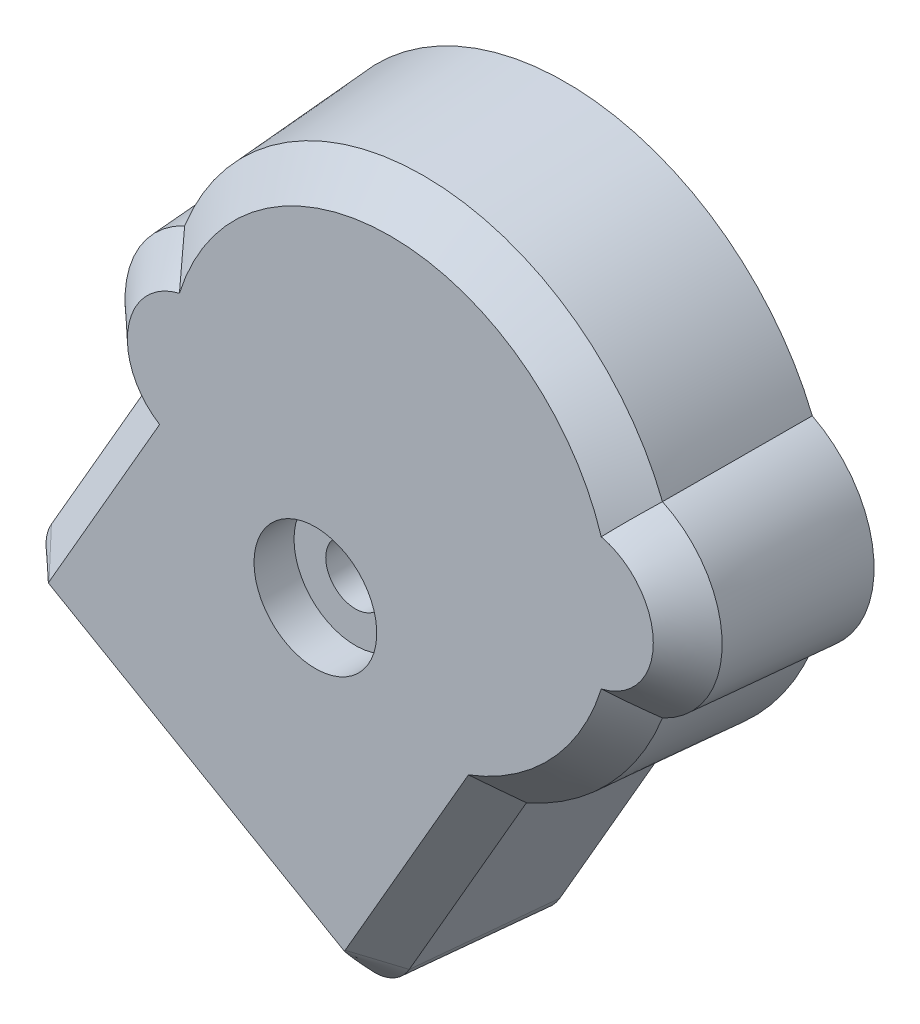
ISO-10303-21;
HEADER;
FILE_DESCRIPTION(('STEP AP214'),'2;1');
FILE_NAME('part.step','',(''),(''),'','','');
FILE_SCHEMA(('AUTOMOTIVE_DESIGN { 1 0 10303 214 1 1 1 1 }'));
ENDSEC;
DATA;
#1=APPLICATION_CONTEXT('core data for automotive mechanical design processes');
#2=APPLICATION_PROTOCOL_DEFINITION('international standard','automotive_design',2000,#1);
#3=PRODUCT_CONTEXT('',#1,'mechanical');
#4=PRODUCT('Part','Part','',(#3));
#5=PRODUCT_RELATED_PRODUCT_CATEGORY('part','',(#4));
#6=PRODUCT_DEFINITION_FORMATION('','',#4);
#7=PRODUCT_DEFINITION_CONTEXT('part definition',#1,'design');
#8=PRODUCT_DEFINITION('design','',#6,#7);
#9=PRODUCT_DEFINITION_SHAPE('','',#8);
#10=(LENGTH_UNIT() NAMED_UNIT(*) SI_UNIT(.MILLI.,.METRE.));
#11=(NAMED_UNIT(*) PLANE_ANGLE_UNIT() SI_UNIT($,.RADIAN.));
#12=(NAMED_UNIT(*) SI_UNIT($,.STERADIAN.) SOLID_ANGLE_UNIT());
#13=UNCERTAINTY_MEASURE_WITH_UNIT(LENGTH_MEASURE(1.E-05),#10,'distance_accuracy_value','');
#14=(GEOMETRIC_REPRESENTATION_CONTEXT(3) GLOBAL_UNCERTAINTY_ASSIGNED_CONTEXT((#13)) GLOBAL_UNIT_ASSIGNED_CONTEXT((#10,
#11,#12)) REPRESENTATION_CONTEXT('',''));
#15=CARTESIAN_POINT('',(0.,0.,0.));
#16=DIRECTION('',(0.,0.,1.));
#17=DIRECTION('',(1.,0.,0.));
#18=AXIS2_PLACEMENT_3D('',#15,#16,#17);
#19=CARTESIAN_POINT('',(0.,0.,13.0302));
#20=DIRECTION('',(0.,0.,1.));
#21=DIRECTION('',(-0.5,-0.866025403784438,0.));
#22=AXIS2_PLACEMENT_3D('',#19,#20,#21);
#23=PLANE('',#22);
#24=CARTESIAN_POINT('',(-2.8575,-4.94933518262807,13.0302));
#25=DIRECTION('',(0.,0.,-1.));
#26=DIRECTION('',(-1.,0.,0.));
#27=AXIS2_PLACEMENT_3D('',#24,#25,#26);
#28=CIRCLE('',#27,2.339213);
#29=CARTESIAN_POINT('',(-5.196713,-4.94933518262807,13.0302));
#30=VERTEX_POINT('',#29);
#31=EDGE_CURVE('E270',#30,#30,#28,.T.);
#32=ORIENTED_EDGE('',*,*,#31,.T.);
#33=EDGE_LOOP('',(#32));
#34=FACE_BOUND('',#33,.T.);
#35=CARTESIAN_POINT('',(0.,0.,13.0302));
#36=DIRECTION('',(0.,0.,1.));
#37=DIRECTION('',(1.,0.,0.));
#38=AXIS2_PLACEMENT_3D('',#35,#36,#37);
#39=CIRCLE('',#38,8.42287491085496);
#40=CARTESIAN_POINT('',(2.97714977771852,-7.87917514495906,13.0302));
#41=VERTEX_POINT('',#40);
#42=CARTESIAN_POINT('',(8.03997791637078,-2.51069250769188,13.0302));
#43=VERTEX_POINT('',#42);
#44=EDGE_CURVE('E226',#41,#43,#39,.T.);
#45=ORIENTED_EDGE('',*,*,#44,.T.);
#46=CARTESIAN_POINT('',(7.4422,0.,13.0302));
#47=DIRECTION('',(0.,0.,1.));
#48=DIRECTION('',(1.,0.,0.));
#49=AXIS2_PLACEMENT_3D('',#46,#47,#48);
#50=CIRCLE('',#49,2.58087491085497);
#51=CARTESIAN_POINT('',(8.03997791637079,2.51069250769184,13.0302));
#52=VERTEX_POINT('',#51);
#53=EDGE_CURVE('E231',#43,#52,#50,.T.);
#54=ORIENTED_EDGE('',*,*,#53,.T.);
#55=CARTESIAN_POINT('',(0.,0.,13.0302));
#56=DIRECTION('',(0.,0.,1.));
#57=DIRECTION('',(1.,0.,0.));
#58=AXIS2_PLACEMENT_3D('',#55,#56,#57);
#59=CIRCLE('',#58,8.42287491085496);
#60=CARTESIAN_POINT('',(-8.03997791637078,2.51069250769188,13.0302));
#61=VERTEX_POINT('',#60);
#62=EDGE_CURVE('E199',#52,#61,#59,.T.);
#63=ORIENTED_EDGE('',*,*,#62,.T.);
#64=CARTESIAN_POINT('',(-7.4422,0.,13.0302));
#65=DIRECTION('',(0.,0.,1.));
#66=DIRECTION('',(1.,0.,0.));
#67=AXIS2_PLACEMENT_3D('',#64,#65,#66);
#68=CIRCLE('',#67,2.58087491085497);
#69=CARTESIAN_POINT('',(-8.79512006550015,-2.19784499040485,13.0302));
#70=VERTEX_POINT('',#69);
#71=EDGE_CURVE('E202',#61,#70,#68,.T.);
#72=ORIENTED_EDGE('',*,*,#71,.T.);
#73=DIRECTION('',(-0.5,-0.866025403784439,0.));
#74=VECTOR('',#73,1.);
#75=CARTESIAN_POINT('',(-13.0106452514896,-9.49934879312487,13.0302));
#76=LINE('',#75,#74);
#77=CARTESIAN_POINT('',(-13.0106452514896,-9.49934879312486,13.0302));
#78=VERTEX_POINT('',#77);
#79=EDGE_CURVE('E205',#70,#78,#76,.T.);
#80=ORIENTED_EDGE('',*,*,#79,.T.);
#81=CARTESIAN_POINT('',(-12.8652613140312,-9.58328624855235,13.0302));
#82=DIRECTION('',(0.,0.,1.));
#83=DIRECTION('',(1.,0.,0.));
#84=AXIS2_PLACEMENT_3D('',#81,#82,#83);
#85=CIRCLE('',#84,0.167874910854965);
#86=CARTESIAN_POINT('',(-13.0305149050033,-9.55373567553977,13.0302));
#87=VERTEX_POINT('',#86);
#88=EDGE_CURVE('E208',#78,#87,#85,.T.);
#89=ORIENTED_EDGE('',*,*,#88,.T.);
#90=DIRECTION('',(0.866025403784439,-0.5,0.));
#91=VECTOR('',#90,1.);
#92=CARTESIAN_POINT('',(-7.39451762428038,-12.8076802227172,13.0302));
#93=LINE('',#92,#91);
#94=CARTESIAN_POINT('',(-1.75852034355745,-16.0616247698946,13.0302));
#95=VERTEX_POINT('',#94);
#96=EDGE_CURVE('E213',#87,#95,#93,.T.);
#97=ORIENTED_EDGE('',*,*,#96,.T.);
#98=CARTESIAN_POINT('',(-1.86673868596883,-15.9332862485524,13.0302));
#99=DIRECTION('',(0.,0.,1.));
#100=DIRECTION('',(1.,0.,0.));
#101=AXIS2_PLACEMENT_3D('',#98,#99,#100);
#102=CIRCLE('',#101,0.167874910854965);
#103=CARTESIAN_POINT('',(-1.72135474851038,-16.0172237039799,13.0302));
#104=VERTEX_POINT('',#103);
#105=EDGE_CURVE('E218',#95,#104,#102,.T.);
#106=ORIENTED_EDGE('',*,*,#105,.T.);
#107=DIRECTION('',(0.5,0.866025403784439,0.));
#108=VECTOR('',#107,1.);
#109=CARTESIAN_POINT('',(2.75930175329234,-8.2564989915937,13.0302));
#110=LINE('',#109,#108);
#111=EDGE_CURVE('E221',#104,#41,#110,.T.);
#112=ORIENTED_EDGE('',*,*,#111,.T.);
#113=EDGE_LOOP('',(#45,#54,#63,#72,#80,#89,#97,#106,#112));
#114=FACE_BOUND('',#113,.T.);
#115=ADVANCED_FACE('F17',(#34,#114),#23,.T.);
#116=CARTESIAN_POINT('',(5.11038430679288,-7.65855473443207,6.35));
#117=DIRECTION('',(0.863915809427104,-0.498782025129913,0.0697564737441253));
#118=DIRECTION('',(0.5,0.866025403784439,0.));
#119=AXIS2_PLACEMENT_3D('',#116,#117,#118);
#120=PLANE('',#119);
#121=CARTESIAN_POINT('',(3.85915401609858,-8.8914989915937,13.0302));
#122=CARTESIAN_POINT('',(3.91372904946232,-8.95267957780813,11.9168408141774));
#123=CARTESIAN_POINT('',(3.96838680305716,-9.01371741153109,10.8034778876465));
#124=CARTESIAN_POINT('',(4.07786775065275,-9.13550757393143,8.57674455431316));
#125=CARTESIAN_POINT('',(4.13269094465333,-9.19625990260912,7.46337414751072));
#126=CARTESIAN_POINT('',(4.18759685888483,-9.25686947879562,6.35));
#127=B_SPLINE_CURVE_WITH_KNOTS('',3,(#121,#122,#123,#124,#125,#126),.UNSPECIFIED.,.F.,.F.,(4,2,
4),(0.,3.34912090556964,6.69824180769493),.UNSPECIFIED.);
#128=CARTESIAN_POINT('',(3.9212900608296,-8.96105764844827,11.76329365617));
#129=VERTEX_POINT('',#128);
#130=CARTESIAN_POINT('',(4.18759685888483,-9.25686947879562,6.35));
#131=VERTEX_POINT('',#130);
#132=EDGE_CURVE('E119',#129,#131,#127,.T.);
#133=ORIENTED_EDGE('',*,*,#132,.F.);
#134=DIRECTION('',(0.5,0.866025403784439,0.));
#135=VECTOR('',#134,1.);
#136=CARTESIAN_POINT('',(-0.544780670211286,-16.6965190648074,11.76329365617));
#137=LINE('',#136,#135);
#138=CARTESIAN_POINT('',(-0.544780670209661,-16.6965190648083,11.7632936561432));
#139=VERTEX_POINT('',#138);
#140=EDGE_CURVE('E236',#129,#139,#137,.F.);
#141=ORIENTED_EDGE('',*,*,#140,.T.);
#142=CARTESIAN_POINT('',(-0.544780670216531,-16.6965190648043,11.7632936562566));
#143=DIRECTION('',(0.0604108783408346,-0.0348782368720628,-0.997564050259824));
#144=VECTOR('',#143,1.);
#145=LINE('',#142,#144);
#146=CARTESIAN_POINT('',(-0.216960291759471,-16.8857862485523,6.35));
#147=VERTEX_POINT('',#146);
#148=EDGE_CURVE('E132',#139,#147,#145,.T.);
#149=ORIENTED_EDGE('',*,*,#148,.T.);
#150=DIRECTION('',(-0.5,-0.866025403784439,0.));
#151=VECTOR('',#150,1.);
#152=CARTESIAN_POINT('',(5.11038430679288,-7.65855473443207,6.35));
#153=LINE('',#152,#151);
#154=EDGE_CURVE('E135',#147,#131,#153,.F.);
#155=ORIENTED_EDGE('',*,*,#154,.T.);
#156=EDGE_LOOP('',(#133,#141,#149,#155));
#157=FACE_BOUND('',#156,.T.);
#158=ADVANCED_FACE('F136',(#157),#120,.T.);
#159=CARTESIAN_POINT('',(0.,0.,6.35));
#160=DIRECTION('',(0.,0.,-1.));
#161=DIRECTION('',(1.,0.,0.));
#162=AXIS2_PLACEMENT_3D('',#159,#160,#161);
#163=CONICAL_SURFACE('',#162,10.16,0.0698131700797732);
#164=CARTESIAN_POINT('',(9.03690624401579,-3.50516042062986,13.0302));
#165=CARTESIAN_POINT('',(9.09801836100279,-3.56285037587307,11.9168713527972));
#166=CARTESIAN_POINT('',(9.15913152168281,-3.62016745538286,10.803523691798));
#167=CARTESIAN_POINT('',(9.28135992953649,-3.73405586210409,8.57679035846411));
#168=CARTESIAN_POINT('',(9.34247517671012,-3.79062718932643,7.46340468612998));
#169=CARTESIAN_POINT('',(9.40359146757673,-3.84682564082623,6.35));
#170=B_SPLINE_CURVE_WITH_KNOTS('',3,(#164,#165,#166,#167,#168,#169),.UNSPECIFIED.,.F.,.F.,(4,2,
4),(0.,3.34948768058312,6.69897531225716),.UNSPECIFIED.);
#171=CARTESIAN_POINT('',(9.10644844872797,-3.57066752451614,11.76329365617));
#172=VERTEX_POINT('',#171);
#173=CARTESIAN_POINT('',(9.40359146757677,-3.84682564082612,6.35));
#174=VERTEX_POINT('',#173);
#175=EDGE_CURVE('E131',#172,#174,#170,.T.);
#176=ORIENTED_EDGE('',*,*,#175,.F.);
#177=CARTESIAN_POINT('',(0.,0.,11.76329365617));
#178=DIRECTION('',(0.,0.,-1.));
#179=DIRECTION('',(-1.,0.,0.));
#180=AXIS2_PLACEMENT_3D('',#177,#178,#179);
#181=CIRCLE('',#180,9.78146563251);
#182=EDGE_CURVE('E127',#172,#129,#181,.T.);
#183=ORIENTED_EDGE('',*,*,#182,.T.);
#184=ORIENTED_EDGE('',*,*,#132,.T.);
#185=CARTESIAN_POINT('',(0.,0.,6.35));
#186=DIRECTION('',(0.,0.,1.));
#187=DIRECTION('',(1.,0.,0.));
#188=AXIS2_PLACEMENT_3D('',#185,#186,#187);
#189=CIRCLE('',#188,10.16);
#190=EDGE_CURVE('E124',#131,#174,#189,.T.);
#191=ORIENTED_EDGE('',*,*,#190,.T.);
#192=EDGE_LOOP('',(#176,#183,#184,#191));
#193=FACE_BOUND('',#192,.T.);
#194=ADVANCED_FACE('F122',(#193),#163,.T.);
#195=CARTESIAN_POINT('',(7.4422,0.,6.35));
#196=DIRECTION('',(0.,0.,-1.));
#197=DIRECTION('',(1.,0.,0.));
#198=AXIS2_PLACEMENT_3D('',#195,#196,#197);
#199=CONICAL_SURFACE('',#198,4.318,0.0698131700797732);
#200=CARTESIAN_POINT('',(9.0369062440158,3.50516042062982,13.0302));
#201=CARTESIAN_POINT('',(9.09801836100281,3.56285037587303,11.9168713527972));
#202=CARTESIAN_POINT('',(9.15913152168283,3.62016745538281,10.803523691798));
#203=CARTESIAN_POINT('',(9.28135992953651,3.73405586210405,8.57679035846411));
#204=CARTESIAN_POINT('',(9.34247517671013,3.79062718932638,7.46340468612998));
#205=CARTESIAN_POINT('',(9.40359146757675,3.84682564082618,6.35));
#206=B_SPLINE_CURVE_WITH_KNOTS('',3,(#200,#201,#202,#203,#204,#205),.UNSPECIFIED.,.F.,.F.,(4,2,
4),(0.,3.34948768058312,6.69897531225717),.UNSPECIFIED.);
#207=CARTESIAN_POINT('',(9.10644844872799,3.5706675245161,11.76329365617));
#208=VERTEX_POINT('',#207);
#209=CARTESIAN_POINT('',(9.40359146757679,3.84682564082607,6.35));
#210=VERTEX_POINT('',#209);
#211=EDGE_CURVE('E158',#208,#210,#206,.T.);
#212=ORIENTED_EDGE('',*,*,#211,.F.);
#213=CARTESIAN_POINT('',(7.4422,0.,11.76329365617));
#214=DIRECTION('',(0.,0.,1.));
#215=DIRECTION('',(1.,0.,0.));
#216=AXIS2_PLACEMENT_3D('',#213,#214,#215);
#217=CIRCLE('',#216,3.93946563251001);
#218=EDGE_CURVE('E183',#208,#172,#217,.F.);
#219=ORIENTED_EDGE('',*,*,#218,.T.);
#220=ORIENTED_EDGE('',*,*,#175,.T.);
#221=CARTESIAN_POINT('',(7.4422,0.,6.35));
#222=DIRECTION('',(0.,0.,1.));
#223=DIRECTION('',(1.,0.,0.));
#224=AXIS2_PLACEMENT_3D('',#221,#222,#223);
#225=CIRCLE('',#224,4.318);
#226=EDGE_CURVE('E148',#210,#174,#225,.F.);
#227=ORIENTED_EDGE('',*,*,#226,.F.);
#228=EDGE_LOOP('',(#212,#219,#220,#227));
#229=FACE_BOUND('',#228,.T.);
#230=ADVANCED_FACE('F482',(#229),#199,.T.);
#231=CARTESIAN_POINT('',(0.,0.,6.35));
#232=DIRECTION('',(0.,0.,-1.));
#233=DIRECTION('',(1.,0.,0.));
#234=AXIS2_PLACEMENT_3D('',#231,#232,#233);
#235=CONICAL_SURFACE('',#234,10.16,0.0698131700797732);
#236=CARTESIAN_POINT('',(-9.03690624401579,3.50516042062986,13.0302));
#237=CARTESIAN_POINT('',(-9.09801836100279,3.56285037587307,11.9168713527972));
#238=CARTESIAN_POINT('',(-9.15913152168281,3.62016745538286,10.803523691798));
#239=CARTESIAN_POINT('',(-9.28135992953649,3.73405586210409,8.57679035846411));
#240=CARTESIAN_POINT('',(-9.34247517671012,3.79062718932643,7.46340468612998));
#241=CARTESIAN_POINT('',(-9.40359146757673,3.84682564082623,6.35));
#242=B_SPLINE_CURVE_WITH_KNOTS('',3,(#236,#237,#238,#239,#240,#241),.UNSPECIFIED.,.F.,.F.,(4,2,
4),(0.,3.34948768058312,6.69897531225716),.UNSPECIFIED.);
#243=CARTESIAN_POINT('',(-9.10644844872797,3.57066752451614,11.76329365617));
#244=VERTEX_POINT('',#243);
#245=CARTESIAN_POINT('',(-9.40359146757677,3.84682564082612,6.35));
#246=VERTEX_POINT('',#245);
#247=EDGE_CURVE('E486',#244,#246,#242,.T.);
#248=ORIENTED_EDGE('',*,*,#247,.F.);
#249=CARTESIAN_POINT('',(0.,0.,11.76329365617));
#250=DIRECTION('',(0.,0.,-1.));
#251=DIRECTION('',(-1.,0.,0.));
#252=AXIS2_PLACEMENT_3D('',#249,#250,#251);
#253=CIRCLE('',#252,9.78146563251);
#254=EDGE_CURVE('E11',#244,#208,#253,.T.);
#255=ORIENTED_EDGE('',*,*,#254,.T.);
#256=ORIENTED_EDGE('',*,*,#211,.T.);
#257=CARTESIAN_POINT('',(0.,0.,6.35));
#258=DIRECTION('',(0.,0.,1.));
#259=DIRECTION('',(1.,0.,0.));
#260=AXIS2_PLACEMENT_3D('',#257,#258,#259);
#261=CIRCLE('',#260,10.16);
#262=EDGE_CURVE('E154',#210,#246,#261,.T.);
#263=ORIENTED_EDGE('',*,*,#262,.T.);
#264=EDGE_LOOP('',(#248,#255,#256,#263));
#265=FACE_BOUND('',#264,.T.);
#266=ADVANCED_FACE('F509',(#265),#235,.T.);
#267=CARTESIAN_POINT('',(-7.4422,0.,6.35));
#268=DIRECTION('',(0.,0.,-1.));
#269=DIRECTION('',(1.,0.,0.));
#270=AXIS2_PLACEMENT_3D('',#267,#268,#269);
#271=CONICAL_SURFACE('',#270,4.318,0.0698131700797732);
#272=CARTESIAN_POINT('',(-10.4096447771023,-2.45428382097521,13.0302));
#273=CARTESIAN_POINT('',(-10.4568776496715,-2.45824666606886,12.4735688036097));
#274=CARTESIAN_POINT('',(-10.5039603988271,-2.46194745280361,11.9169230421419));
#275=CARTESIAN_POINT('',(-10.5978432670338,-2.46885580650905,10.8036051340219));
#276=CARTESIAN_POINT('',(-10.6446433863445,-2.4720633739326,10.2469329873943));
#277=CARTESIAN_POINT('',(-10.7379786920371,-2.47801619273649,9.13356410593066));
#278=CARTESIAN_POINT('',(-10.7845138784544,-2.48076144417846,8.57686737109787));
#279=CARTESIAN_POINT('',(-10.8773345003111,-2.4858161045025,7.46345058293015));
#280=CARTESIAN_POINT('',(-10.9236199355212,-2.48812551298445,6.9067305295743));
#281=CARTESIAN_POINT('',(-10.9697880402556,-2.49023023398412,6.35));
#282=B_SPLINE_CURVE_WITH_KNOTS('',3,(#272,#273,#274,#275,#276,#277,#278,#279,#280,#281),
.UNSPECIFIED.,.F.,.F.,(4,2,2,2,4),(0.,1.67593674435968,3.35187194983627,5.02780693181866,
6.70374345238378),.UNSPECIFIED.);
#283=CARTESIAN_POINT('',(-10.5168905772765,-2.4628575524652,11.76329365617));
#284=VERTEX_POINT('',#283);
#285=CARTESIAN_POINT('',(-10.9697880402554,-2.4902302339838,6.35));
#286=VERTEX_POINT('',#285);
#287=EDGE_CURVE('E489',#284,#286,#282,.T.);
#288=ORIENTED_EDGE('',*,*,#287,.F.);
#289=CARTESIAN_POINT('',(-7.4422,0.,11.76329365617));
#290=DIRECTION('',(0.,0.,1.));
#291=DIRECTION('',(1.,0.,0.));
#292=AXIS2_PLACEMENT_3D('',#289,#290,#291);
#293=CIRCLE('',#292,3.93946563251001);
#294=EDGE_CURVE('E29',#284,#244,#293,.F.);
#295=ORIENTED_EDGE('',*,*,#294,.T.);
#296=ORIENTED_EDGE('',*,*,#247,.T.);
#297=CARTESIAN_POINT('',(-7.4422,0.,6.35));
#298=DIRECTION('',(0.,0.,1.));
#299=DIRECTION('',(1.,0.,0.));
#300=AXIS2_PLACEMENT_3D('',#297,#298,#299);
#301=CIRCLE('',#300,4.318);
#302=EDGE_CURVE('E172',#286,#246,#301,.F.);
#303=ORIENTED_EDGE('',*,*,#302,.F.);
#304=EDGE_LOOP('',(#288,#295,#296,#303));
#305=FACE_BOUND('',#304,.T.);
#306=ADVANCED_FACE('F507',(#305),#271,.T.);
#307=CARTESIAN_POINT('',(-9.1876951096882,0.596445265567933,6.35));
#308=DIRECTION('',(-0.863915809427104,0.498782025129913,0.0697564737441253));
#309=DIRECTION('',(-0.5,-0.866025403784439,0.));
#310=AXIS2_PLACEMENT_3D('',#307,#308,#309);
#311=PLANE('',#310);
#312=CARTESIAN_POINT('',(-14.1872193297904,-8.82005343229641,11.7632936561432));
#313=DIRECTION('',(-0.0604108783408348,0.0348782368720626,-0.997564050259824));
#314=VECTOR('',#313,1.);
#315=LINE('',#312,#314);
#316=CARTESIAN_POINT('',(-14.1872193298007,-8.82005343229046,11.7632936559731));
#317=VERTEX_POINT('',#316);
#318=CARTESIAN_POINT('',(-14.5150397082405,-8.63078624855234,6.35));
#319=VERTEX_POINT('',#318);
#320=EDGE_CURVE('E494',#317,#319,#315,.T.);
#321=ORIENTED_EDGE('',*,*,#320,.F.);
#322=DIRECTION('',(-0.5,-0.866025403784439,0.));
#323=VECTOR('',#322,1.);
#324=CARTESIAN_POINT('',(-10.4863665925951,-2.40998846014769,11.76329365617));
#325=LINE('',#324,#323);
#326=EDGE_CURVE('E44',#317,#284,#325,.F.);
#327=ORIENTED_EDGE('',*,*,#326,.T.);
#328=ORIENTED_EDGE('',*,*,#287,.T.);
#329=DIRECTION('',(0.5,0.866025403784439,0.));
#330=VECTOR('',#329,1.);
#331=CARTESIAN_POINT('',(-9.1876951096882,0.596445265567933,6.35));
#332=LINE('',#331,#330);
#333=EDGE_CURVE('E176',#286,#319,#332,.F.);
#334=ORIENTED_EDGE('',*,*,#333,.T.);
#335=EDGE_LOOP('',(#321,#327,#328,#334));
#336=FACE_BOUND('',#335,.T.);
#337=ADVANCED_FACE('F516',(#336),#311,.T.);
#338=CARTESIAN_POINT('',(-9.40359146757676,3.84682564082614,6.35));
#339=DIRECTION('',(0.,0.,1.));
#340=DIRECTION('',(1.,0.,0.));
#341=AXIS2_PLACEMENT_3D('',#338,#339,#340);
#342=PLANE('',#341);
#343=CARTESIAN_POINT('',(-2.8575,-4.94933518262807,6.35));
#344=DIRECTION('',(0.,0.,1.));
#345=DIRECTION('',(1.,0.,0.));
#346=AXIS2_PLACEMENT_3D('',#343,#344,#345);
#347=CIRCLE('',#346,1.1303);
#348=CARTESIAN_POINT('',(-1.7272,-4.94933518262807,6.35));
#349=VERTEX_POINT('',#348);
#350=EDGE_CURVE('E23',#349,#349,#347,.F.);
#351=ORIENTED_EDGE('',*,*,#350,.F.);
#352=EDGE_LOOP('',(#351));
#353=FACE_BOUND('',#352,.T.);
#354=CARTESIAN_POINT('',(-1.86673868596883,-15.9332862485524,6.35));
#355=DIRECTION('',(0.,0.,1.));
#356=DIRECTION('',(1.,0.,0.));
#357=AXIS2_PLACEMENT_3D('',#354,#355,#356);
#358=CIRCLE('',#357,1.905);
#359=CARTESIAN_POINT('',(-2.20928277668746,-17.8072362334543,6.35));
#360=VERTEX_POINT('',#359);
#361=EDGE_CURVE('E143',#147,#360,#358,.F.);
#362=ORIENTED_EDGE('',*,*,#361,.T.);
#363=DIRECTION('',(-0.866025403784439,0.5,0.));
#364=VECTOR('',#363,1.);
#365=CARTESIAN_POINT('',(-7.72945542442082,-14.6201630693122,6.35));
#366=LINE('',#365,#364);
#367=CARTESIAN_POINT('',(-14.3168775610183,-10.8169131254819,6.35));
#368=VERTEX_POINT('',#367);
#369=EDGE_CURVE('E166',#360,#368,#366,.T.);
#370=ORIENTED_EDGE('',*,*,#369,.T.);
#371=CARTESIAN_POINT('',(-12.8652613140312,-9.58328624855235,6.35));
#372=DIRECTION('',(0.,0.,1.));
#373=DIRECTION('',(1.,0.,0.));
#374=AXIS2_PLACEMENT_3D('',#371,#372,#373);
#375=CIRCLE('',#374,1.905);
#376=EDGE_CURVE('E170',#368,#319,#375,.F.);
#377=ORIENTED_EDGE('',*,*,#376,.T.);
#378=ORIENTED_EDGE('',*,*,#333,.F.);
#379=ORIENTED_EDGE('',*,*,#302,.T.);
#380=ORIENTED_EDGE('',*,*,#262,.F.);
#381=ORIENTED_EDGE('',*,*,#226,.T.);
#382=ORIENTED_EDGE('',*,*,#190,.F.);
#383=ORIENTED_EDGE('',*,*,#154,.F.);
#384=EDGE_LOOP('',(#362,#370,#377,#378,#379,#380,#381,#382,#383));
#385=FACE_BOUND('',#384,.T.);
#386=ADVANCED_FACE('F145',(#353,#385),#342,.F.);
#387=CARTESIAN_POINT('',(-12.8652613140312,-9.58328624855235,6.35));
#388=DIRECTION('',(0.,0.,-1.));
#389=DIRECTION('',(1.,0.,0.));
#390=AXIS2_PLACEMENT_3D('',#387,#388,#389);
#391=CONICAL_SURFACE('',#390,1.905,0.0698131700797732);
#392=CARTESIAN_POINT('',(-14.0082018009887,-10.4557375667011,13.0302));
#393=CARTESIAN_POINT('',(-14.0502422134306,-10.5036355690243,12.1363927279933));
#394=CARTESIAN_POINT('',(-14.0919858910674,-10.5517052515117,11.2425809944511));
#395=CARTESIAN_POINT('',(-14.1952409712113,-10.6718869929506,9.01585312138677));
#396=CARTESIAN_POINT('',(-14.2563892135864,-10.744209163389,7.68293152159574));
#397=CARTESIAN_POINT('',(-14.3168775610244,-10.8169131254784,6.35000000000009));
#398=B_SPLINE_CURVE_WITH_KNOTS('',3,(#392,#393,#394,#395,#396,#397),.UNSPECIFIED.,.F.,.F.,(4,2,
4),(0.,2.68822874698829,6.6970747599511),.UNSPECIFIED.);
#399=CARTESIAN_POINT('',(-14.0676198781947,-10.5237282778219,11.76329365617));
#400=VERTEX_POINT('',#399);
#401=EDGE_CURVE('E551',#400,#368,#398,.T.);
#402=ORIENTED_EDGE('',*,*,#401,.F.);
#403=CARTESIAN_POINT('',(-12.8652613140312,-9.58328624855235,11.76329365617));
#404=DIRECTION('',(0.,0.,1.));
#405=DIRECTION('',(1.,0.,0.));
#406=AXIS2_PLACEMENT_3D('',#403,#404,#405);
#407=CIRCLE('',#406,1.52646563251);
#408=EDGE_CURVE('E439',#400,#317,#407,.F.);
#409=ORIENTED_EDGE('',*,*,#408,.T.);
#410=ORIENTED_EDGE('',*,*,#320,.T.);
#411=ORIENTED_EDGE('',*,*,#376,.F.);
#412=EDGE_LOOP('',(#402,#409,#410,#411));
#413=FACE_BOUND('',#412,.T.);
#414=ADVANCED_FACE('F558',(#413),#391,.T.);
#415=CARTESIAN_POINT('',(-1.86673868596883,-15.9332862485524,6.35));
#416=DIRECTION('',(0.,0.,-1.));
#417=DIRECTION('',(1.,0.,0.));
#418=AXIS2_PLACEMENT_3D('',#415,#416,#417);
#419=CONICAL_SURFACE('',#418,1.905,0.0698131700797732);
#420=ORIENTED_EDGE('',*,*,#148,.F.);
#421=CARTESIAN_POINT('',(-1.86673868596883,-15.9332862485524,11.76329365617));
#422=DIRECTION('',(0.,0.,1.));
#423=DIRECTION('',(1.,0.,0.));
#424=AXIS2_PLACEMENT_3D('',#421,#422,#423);
#425=CIRCLE('',#424,1.52646563251);
#426=CARTESIAN_POINT('',(-2.08000609202104,-17.4447803242106,11.76329365617));
#427=VERTEX_POINT('',#426);
#428=EDGE_CURVE('E525',#139,#427,#425,.F.);
#429=ORIENTED_EDGE('',*,*,#428,.T.);
#430=CARTESIAN_POINT('',(-2.05083344757205,-17.3593274043457,13.0302));
#431=CARTESIAN_POINT('',(-2.07129412815355,-17.4196844706675,12.1363927279933));
#432=CARTESIAN_POINT('',(-2.09205185552107,-17.4798703971921,11.2425809944511));
#433=CARTESIAN_POINT('',(-2.14450475660627,-17.629382790386,9.01585312138677));
#434=CARTESIAN_POINT('',(-2.17656347227518,-17.7184998068988,7.68293152159573));
#435=CARTESIAN_POINT('',(-2.20928277668134,-17.8072362334578,6.35000000000009));
#436=B_SPLINE_CURVE_WITH_KNOTS('',3,(#430,#431,#432,#433,#434,#435),.UNSPECIFIED.,.F.,.F.,(4,2,
4),(0.,2.68822874698829,6.6970747599511),.UNSPECIFIED.);
#437=EDGE_CURVE('E171',#427,#360,#436,.T.);
#438=ORIENTED_EDGE('',*,*,#437,.T.);
#439=ORIENTED_EDGE('',*,*,#361,.F.);
#440=EDGE_LOOP('',(#420,#429,#438,#439));
#441=FACE_BOUND('',#440,.T.);
#442=ADVANCED_FACE('F468',(#441),#419,.T.);
#443=CARTESIAN_POINT('',(-7.72945542442082,-14.6201630693122,6.35));
#444=DIRECTION('',(-0.498782025129911,-0.863915809427105,0.0697564737441253));
#445=DIRECTION('',(0.866025403784439,-0.5,0.));
#446=AXIS2_PLACEMENT_3D('',#443,#444,#445);
#447=PLANE('',#446);
#448=ORIENTED_EDGE('',*,*,#437,.F.);
#449=DIRECTION('',(-0.866025403784439,0.5,0.));
#450=VECTOR('',#449,1.);
#451=CARTESIAN_POINT('',(-7.54018824067583,-14.2923426908604,11.76329365617));
#452=LINE('',#451,#450);
#453=EDGE_CURVE('E524',#427,#400,#452,.T.);
#454=ORIENTED_EDGE('',*,*,#453,.T.);
#455=ORIENTED_EDGE('',*,*,#401,.T.);
#456=ORIENTED_EDGE('',*,*,#369,.F.);
#457=EDGE_LOOP('',(#448,#454,#455,#456));
#458=FACE_BOUND('',#457,.T.);
#459=ADVANCED_FACE('F465',(#458),#447,.T.);
#460=CARTESIAN_POINT('',(-12.8652613140312,-9.58328624855235,11.76329365617));
#461=DIRECTION('',(0.,0.,-1.));
#462=DIRECTION('',(-1.,0.,0.));
#463=AXIS2_PLACEMENT_3D('',#460,#461,#462);
#464=CONICAL_SURFACE('',#463,1.52646563251,0.820304748437336);
#465=CARTESIAN_POINT('',(-14.1872193297887,-8.82005343229735,11.76329365617));
#466=DIRECTION('',(0.633370884753987,-0.365676850809585,0.681998360062498));
#467=VECTOR('',#466,1.);
#468=LINE('',#465,#467);
#469=EDGE_CURVE('E413',#317,#78,#468,.T.);
#470=ORIENTED_EDGE('',*,*,#469,.F.);
#471=ORIENTED_EDGE('',*,*,#408,.F.);
#472=CARTESIAN_POINT('',(-14.0676198781947,-10.5237282778219,11.76329365617));
#473=CARTESIAN_POINT('',(-14.029233053036,-10.4795581501705,11.8168627921183));
#474=CARTESIAN_POINT('',(-13.9905980951793,-10.4355662612242,11.8704036794824));
#475=CARTESIAN_POINT('',(-13.9127168952505,-10.3480584548135,11.977386084203));
#476=CARTESIAN_POINT('',(-13.8734708833227,-10.3045423681769,12.0308276308732));
#477=CARTESIAN_POINT('',(-13.7943480241056,-10.2182077888709,12.1374414917998));
#478=CARTESIAN_POINT('',(-13.7544735248702,-10.1753875443764,12.1906141260003));
#479=CARTESIAN_POINT('',(-13.6737634571546,-10.0904487200898,12.296840848575));
#480=CARTESIAN_POINT('',(-13.6329275060471,-10.0483304314437,12.3498948802279));
#481=CARTESIAN_POINT('',(-13.5497382609293,-9.96478649697445,12.4561510504016));
#482=CARTESIAN_POINT('',(-13.5073766523565,-9.92336735860022,12.5093518103529));
#483=CARTESIAN_POINT('',(-13.4209542262979,-9.84196769348952,12.6153838027188));
#484=CARTESIAN_POINT('',(-13.3768950220569,-9.80198586746916,12.6682153322237));
#485=CARTESIAN_POINT('',(-13.3086807639337,-9.74363928510582,12.7471403799438));
#486=CARTESIAN_POINT('',(-13.2855267739557,-9.72441461232663,12.7734615973864));
#487=CARTESIAN_POINT('',(-13.2383325873554,-9.68677648311862,12.8258621092812));
#488=CARTESIAN_POINT('',(-13.2142929272372,-9.66836254994726,12.8519415385928));
#489=CARTESIAN_POINT('',(-13.1772526222027,-9.64159547600717,12.8908284607349));
#490=CARTESIAN_POINT('',(-13.1647186829781,-9.6328002034833,12.9037754060545));
#491=CARTESIAN_POINT('',(-13.1392659940556,-9.61559369952994,12.929538572899));
#492=CARTESIAN_POINT('',(-13.1263473447644,-9.60718236932077,12.9423548273812));
#493=CARTESIAN_POINT('',(-13.1000040755657,-9.59083388687366,12.9678403114842));
#494=CARTESIAN_POINT('',(-13.0865784744465,-9.58289774009847,12.980509186609));
#495=CARTESIAN_POINT('',(-13.0590742646311,-9.56773044313856,13.005582064184));
#496=CARTESIAN_POINT('',(-13.0449950825863,-9.56049992989542,13.0179858195799));
#497=CARTESIAN_POINT('',(-13.0305149050033,-9.55373567553977,13.0302));
#498=B_SPLINE_CURVE_WITH_KNOTS('',3,(#472,#473,#474,#475,#476,#477,#478,#479,#480,#481,#482,
#483,#484,#485,#486,#487,#488,#489,#490,#491,#492,#493,#494,#495,#496,#497),.UNSPECIFIED.,.F.,
.F.,(4,2,2,2,2,2,2,2,2,2,2,2,4),(0.,0.238010053035333,0.475932533332771,0.713113290198422,
0.950390088612537,1.18925211825779,1.42789249765786,1.54782474147909,1.6676854925201,
1.72783513026016,1.7879692046134,1.84822632319142,1.90853733942914),.UNSPECIFIED.);
#499=EDGE_CURVE('E419',#87,#400,#498,.F.);
#500=ORIENTED_EDGE('',*,*,#499,.F.);
#501=ORIENTED_EDGE('',*,*,#88,.F.);
#502=EDGE_LOOP('',(#470,#471,#500,#501));
#503=FACE_BOUND('',#502,.T.);
#504=ADVANCED_FACE('F20',(#503),#464,.T.);
#505=CARTESIAN_POINT('',(-7.54018824067583,-14.2923426908604,11.76329365617));
#506=DIRECTION('',(0.340999180031249,0.590627905153451,-0.73135370161917));
#507=DIRECTION('',(-0.866025403784439,0.5,0.));
#508=AXIS2_PLACEMENT_3D('',#505,#506,#507);
#509=PLANE('',#508);
#510=ORIENTED_EDGE('',*,*,#499,.T.);
#511=ORIENTED_EDGE('',*,*,#453,.F.);
#512=CARTESIAN_POINT('',(-2.08000609202104,-17.4447803242106,11.76329365617));
#513=CARTESIAN_POINT('',(-2.06094705196583,-17.3894512946267,11.8168627921183));
#514=CARTESIAN_POINT('',(-2.04216643750627,-17.3339964951756,11.8704036794824));
#515=CARTESIAN_POINT('',(-2.00532305408956,-17.2227954943546,11.977386084203));
#516=CARTESIAN_POINT('',(-1.98726002355286,-17.1670494077097,12.0308276308732));
#517=CARTESIAN_POINT('',(-1.95205351425736,-17.0553597119546,12.1374414917998));
#518=CARTESIAN_POINT('',(-1.93490734434666,-16.9994172604063,12.1906141260002));
#519=CARTESIAN_POINT('',(-1.90170319860466,-16.8870508792801,12.2968408485749));
#520=CARTESIAN_POINT('',(-1.88564566622696,-16.8306267639102,12.3498948802279));
#521=CARTESIAN_POINT('',(-1.85488911920338,-16.7168107970819,12.4561510504016));
#522=CARTESIAN_POINT('',(-1.84019989745481,-16.6594149987257,12.5093518103529));
#523=CARTESIAN_POINT('',(-1.81291693263872,-16.5438711497468,12.6153838027188));
#524=CARTESIAN_POINT('',(-1.8003212577359,-16.4857238465934,12.6682153322237));
#525=CARTESIAN_POINT('',(-1.78389876424682,-16.3974752749768,12.7471403799438));
#526=CARTESIAN_POINT('',(-1.7788267042296,-16.3678109950673,12.7734615973864));
#527=CARTESIAN_POINT('',(-1.76982822148472,-16.3081205659564,12.8258621092812));
#528=CARTESIAN_POINT('',(-1.76590111763383,-16.27809464301,12.8519415385928));
#529=CARTESIAN_POINT('',(-1.76124030413395,-16.2326332609163,12.8908284607349));
#530=CARTESIAN_POINT('',(-1.75989034430741,-16.2173809148763,12.9037754060545));
#531=CARTESIAN_POINT('',(-1.75771541923474,-16.1867349876981,12.929538572899));
#532=CARTESIAN_POINT('',(-1.75689031823955,-16.1713414441248,12.9423548273811));
#533=CARTESIAN_POINT('',(-1.75590375172641,-16.1403532625564,12.9678403114841));
#534=CARTESIAN_POINT('',(-1.75574364757052,-16.1247582775385,12.980509186609));
#535=CARTESIAN_POINT('',(-1.75636048800418,-16.0933552846474,13.005582064184));
#536=CARTESIAN_POINT('',(-1.75713827087564,-16.0775470987105,13.0179858195799));
#537=CARTESIAN_POINT('',(-1.75852034355745,-16.0616247698946,13.0302));
#538=B_SPLINE_CURVE_WITH_KNOTS('',3,(#512,#513,#514,#515,#516,#517,#518,#519,#520,#521,#522,
#523,#524,#525,#526,#527,#528,#529,#530,#531,#532,#533,#534,#535,#536,#537),.UNSPECIFIED.,.F.,
.F.,(4,2,2,2,2,2,2,2,2,2,2,2,4),(0.,0.238010053035334,0.475932533332777,0.71311329019843,
0.950390088612543,1.1892521182578,1.42789249765787,1.5478247414791,1.66768549252011,
1.72783513026017,1.78796920461341,1.84822632319144,1.90853733942915),.UNSPECIFIED.);
#539=EDGE_CURVE('E406',#95,#427,#538,.F.);
#540=ORIENTED_EDGE('',*,*,#539,.F.);
#541=ORIENTED_EDGE('',*,*,#96,.F.);
#542=EDGE_LOOP('',(#510,#511,#540,#541));
#543=FACE_BOUND('',#542,.T.);
#544=ADVANCED_FACE('F402',(#543),#509,.F.);
#545=CARTESIAN_POINT('',(-5.64464525148963,3.25893745542748,13.0302));
#546=DIRECTION('',(0.590627905153449,-0.340999180031249,-0.731353701619172));
#547=DIRECTION('',(-0.5,-0.866025403784439,0.));
#548=AXIS2_PLACEMENT_3D('',#545,#546,#547);
#549=PLANE('',#548);
#550=ORIENTED_EDGE('',*,*,#469,.T.);
#551=ORIENTED_EDGE('',*,*,#79,.F.);
#552=CARTESIAN_POINT('',(-10.5168905772765,-2.4628575524652,11.76329365617));
#553=CARTESIAN_POINT('',(-10.3748916671925,-2.45202057949827,11.8729165646529));
#554=CARTESIAN_POINT('',(-10.2324965768074,-2.4390482877025,11.9818638126075));
#555=CARTESIAN_POINT('',(-9.94712480502587,-2.40789322666415,12.1977985663931));
#556=CARTESIAN_POINT('',(-9.80414925555641,-2.38971798299142,12.3047886669543));
#557=CARTESIAN_POINT('',(-9.5173117194045,-2.34717565897942,12.5165977480448));
#558=CARTESIAN_POINT('',(-9.37344915140502,-2.32280397327964,12.621415050751));
#559=CARTESIAN_POINT('',(-9.157055598669,-2.28056584029254,12.7764766875151));
#560=CARTESIAN_POINT('',(-9.08477153159581,-2.26552665048037,12.8278398454973));
#561=CARTESIAN_POINT('',(-8.94005138914697,-2.23333018709658,12.9297013480635));
#562=CARTESIAN_POINT('',(-8.86761529366354,-2.2161726133796,12.9801995689411));
#563=CARTESIAN_POINT('',(-8.79512006550015,-2.19784499040485,13.0302));
#564=B_SPLINE_CURVE_WITH_KNOTS('',3,(#552,#553,#554,#555,#556,#557,#558,#559,#560,#561,#562,
#563),.UNSPECIFIED.,.F.,.F.,(4,2,2,2,2,4),(0.,0.539179698819951,1.07758343269323,
1.61638849830095,1.88618481885717,2.15601940973981),.UNSPECIFIED.);
#565=EDGE_CURVE('E414',#284,#70,#564,.T.);
#566=ORIENTED_EDGE('',*,*,#565,.F.);
#567=ORIENTED_EDGE('',*,*,#326,.F.);
#568=EDGE_LOOP('',(#550,#551,#566,#567));
#569=FACE_BOUND('',#568,.T.);
#570=ADVANCED_FACE('F401',(#569),#549,.F.);
#571=CARTESIAN_POINT('',(-1.86673868596883,-15.9332862485524,11.76329365617));
#572=DIRECTION('',(0.,0.,-1.));
#573=DIRECTION('',(-1.,0.,0.));
#574=AXIS2_PLACEMENT_3D('',#571,#572,#573);
#575=CONICAL_SURFACE('',#574,1.52646563251,0.820304748437336);
#576=ORIENTED_EDGE('',*,*,#539,.T.);
#577=ORIENTED_EDGE('',*,*,#428,.F.);
#578=CARTESIAN_POINT('',(-1.72135474851037,-16.0172237039798,13.0302));
#579=DIRECTION('',(0.633370884753986,-0.365676850809586,-0.681998360062498));
#580=VECTOR('',#579,1.);
#581=LINE('',#578,#580);
#582=EDGE_CURVE('E381',#104,#139,#581,.T.);
#583=ORIENTED_EDGE('',*,*,#582,.F.);
#584=ORIENTED_EDGE('',*,*,#105,.F.);
#585=EDGE_LOOP('',(#576,#577,#583,#584));
#586=FACE_BOUND('',#585,.T.);
#587=ADVANCED_FACE('F389',(#586),#575,.T.);
#588=CARTESIAN_POINT('',(-7.4422,0.,11.76329365617));
#589=DIRECTION('',(0.,0.,-1.));
#590=DIRECTION('',(-1.,0.,0.));
#591=AXIS2_PLACEMENT_3D('',#588,#589,#590);
#592=CONICAL_SURFACE('',#591,3.93946563251001,0.820304748437336);
#593=ORIENTED_EDGE('',*,*,#565,.T.);
#594=ORIENTED_EDGE('',*,*,#71,.F.);
#595=CARTESIAN_POINT('',(-9.10644844872797,3.57066752451614,11.76329365617));
#596=CARTESIAN_POINT('',(-9.01615593159142,3.4858264620725,11.8705560317243));
#597=CARTESIAN_POINT('',(-8.92610339334836,3.40036175234844,11.9775333260022));
#598=CARTESIAN_POINT('',(-8.74665442746996,3.22785487476453,12.1907084924686));
#599=CARTESIAN_POINT('',(-8.65725786343537,3.14081304869689,12.2969065266917));
#600=CARTESIAN_POINT('',(-8.47924643024134,2.9647741047938,12.5083739860779));
#601=CARTESIAN_POINT('',(-8.39063166588809,2.87577673022097,12.6136432867372));
#602=CARTESIAN_POINT('',(-8.21444771051635,2.69526084542487,12.8229398063948));
#603=CARTESIAN_POINT('',(-8.1268787499583,2.60374179368414,12.9269667516193));
#604=CARTESIAN_POINT('',(-8.03997791637078,2.51069250769188,13.0302));
#605=B_SPLINE_CURVE_WITH_KNOTS('',3,(#595,#596,#597,#598,#599,#600,#601,#602,#603,#604),
.UNSPECIFIED.,.F.,.F.,(4,2,2,2,4),(0.,0.49163763794002,0.983169973366352,1.47476723061207,
1.96647089155535),.UNSPECIFIED.);
#606=EDGE_CURVE('E345',#244,#61,#605,.T.);
#607=ORIENTED_EDGE('',*,*,#606,.F.);
#608=ORIENTED_EDGE('',*,*,#294,.F.);
#609=EDGE_LOOP('',(#593,#594,#607,#608));
#610=FACE_BOUND('',#609,.T.);
#611=ADVANCED_FACE('F359',(#610),#592,.T.);
#612=CARTESIAN_POINT('',(5.64464525148963,-3.25893745542748,13.0302));
#613=DIRECTION('',(-0.59062790515345,0.34099918003125,-0.731353701619171));
#614=DIRECTION('',(0.5,0.866025403784439,0.));
#615=AXIS2_PLACEMENT_3D('',#612,#613,#614);
#616=PLANE('',#615);
#617=ORIENTED_EDGE('',*,*,#582,.T.);
#618=ORIENTED_EDGE('',*,*,#140,.F.);
#619=CARTESIAN_POINT('',(3.9212900608296,-8.96105764844827,11.76329365617));
#620=CARTESIAN_POINT('',(3.84164931194647,-8.87203628193955,11.8691169554725));
#621=CARTESIAN_POINT('',(3.76222921576636,-8.78275139145826,11.9748849297181));
#622=CARTESIAN_POINT('',(3.60386127377964,-8.60362641267308,12.1862983625969));
#623=CARTESIAN_POINT('',(3.52491341661068,-8.51378633783383,12.2919438241282));
#624=CARTESIAN_POINT('',(3.36751670712506,-8.33351815309622,12.5031059357588));
#625=CARTESIAN_POINT('',(3.28906785696408,-8.24309004066097,12.6086225853001));
#626=CARTESIAN_POINT('',(3.13270142334331,-8.06160921136835,12.8195180696115));
#627=CARTESIAN_POINT('',(3.05478385276668,-7.97055647947103,12.92489690099));
#628=CARTESIAN_POINT('',(2.97714977771852,-7.87917514495905,13.0302));
#629=B_SPLINE_CURVE_WITH_KNOTS('',3,(#619,#620,#621,#622,#623,#624,#625,#626,#627,#628),
.UNSPECIFIED.,.F.,.F.,(4,2,2,2,4),(0.,0.47874222473373,0.957472883955031,1.43620560986758,
1.91494990372513),.UNSPECIFIED.);
#630=EDGE_CURVE('E308',#41,#129,#629,.F.);
#631=ORIENTED_EDGE('',*,*,#630,.F.);
#632=ORIENTED_EDGE('',*,*,#111,.F.);
#633=EDGE_LOOP('',(#617,#618,#631,#632));
#634=FACE_BOUND('',#633,.T.);
#635=ADVANCED_FACE('F353',(#634),#616,.F.);
#636=CARTESIAN_POINT('',(0.,0.,13.0302));
#637=DIRECTION('',(0.,0.,-1.));
#638=DIRECTION('',(-1.,0.,0.));
#639=AXIS2_PLACEMENT_3D('',#636,#637,#638);
#640=CONICAL_SURFACE('',#639,8.42287491085496,0.820304748437336);
#641=ORIENTED_EDGE('',*,*,#606,.T.);
#642=ORIENTED_EDGE('',*,*,#62,.F.);
#643=CARTESIAN_POINT('',(8.03997791637079,2.51069250769184,13.0302));
#644=CARTESIAN_POINT('',(8.12687874995831,2.60374179368409,12.9269667516193));
#645=CARTESIAN_POINT('',(8.21444771051636,2.69526084542483,12.8229398063948));
#646=CARTESIAN_POINT('',(8.3906316658881,2.87577673022093,12.6136432867372));
#647=CARTESIAN_POINT('',(8.47924643024136,2.96477410479375,12.5083739860779));
#648=CARTESIAN_POINT('',(8.65725786343538,3.14081304869684,12.2969065266917));
#649=CARTESIAN_POINT('',(8.74665442746998,3.22785487476448,12.1907084924686));
#650=CARTESIAN_POINT('',(8.92610339334838,3.40036175234839,11.9775333260022));
#651=CARTESIAN_POINT('',(9.01615593159144,3.48582646207245,11.8705560317243));
#652=CARTESIAN_POINT('',(9.10644844872798,3.5706675245161,11.76329365617));
#653=B_SPLINE_CURVE_WITH_KNOTS('',3,(#643,#644,#645,#646,#647,#648,#649,#650,#651,#652),
.UNSPECIFIED.,.F.,.F.,(4,2,2,2,4),(0.,0.491703660943279,0.983300918189,1.47483325361533,
1.96647089155535),.UNSPECIFIED.);
#654=EDGE_CURVE('E299',#208,#52,#653,.F.);
#655=ORIENTED_EDGE('',*,*,#654,.F.);
#656=ORIENTED_EDGE('',*,*,#254,.F.);
#657=EDGE_LOOP('',(#641,#642,#655,#656));
#658=FACE_BOUND('',#657,.T.);
#659=ADVANCED_FACE('F333',(#658),#640,.T.);
#660=CARTESIAN_POINT('',(0.,0.,13.0302));
#661=DIRECTION('',(0.,0.,-1.));
#662=DIRECTION('',(-1.,0.,0.));
#663=AXIS2_PLACEMENT_3D('',#660,#661,#662);
#664=CONICAL_SURFACE('',#663,8.42287491085496,0.820304748437336);
#665=ORIENTED_EDGE('',*,*,#630,.T.);
#666=ORIENTED_EDGE('',*,*,#182,.F.);
#667=CARTESIAN_POINT('',(9.10644844872797,-3.57066752451614,11.76329365617));
#668=CARTESIAN_POINT('',(9.01615593159142,-3.4858264620725,11.8705560317243));
#669=CARTESIAN_POINT('',(8.92610339334836,-3.40036175234844,11.9775333260022));
#670=CARTESIAN_POINT('',(8.74665442746996,-3.22785487476452,12.1907084924686));
#671=CARTESIAN_POINT('',(8.65725786343537,-3.14081304869688,12.2969065266917));
#672=CARTESIAN_POINT('',(8.47924643024134,-2.9647741047938,12.5083739860779));
#673=CARTESIAN_POINT('',(8.39063166588809,-2.87577673022097,12.6136432867372));
#674=CARTESIAN_POINT('',(8.21444771051635,-2.69526084542487,12.8229398063948));
#675=CARTESIAN_POINT('',(8.1268787499583,-2.60374179368413,12.9269667516193));
#676=CARTESIAN_POINT('',(8.03997791637078,-2.51069250769188,13.0302));
#677=B_SPLINE_CURVE_WITH_KNOTS('',3,(#667,#668,#669,#670,#671,#672,#673,#674,#675,#676),
.UNSPECIFIED.,.F.,.F.,(4,2,2,2,4),(0.,0.49163763794002,0.983169973366353,1.47476723061207,
1.96647089155535),.UNSPECIFIED.);
#678=EDGE_CURVE('E296',#43,#172,#677,.F.);
#679=ORIENTED_EDGE('',*,*,#678,.F.);
#680=ORIENTED_EDGE('',*,*,#44,.F.);
#681=EDGE_LOOP('',(#665,#666,#679,#680));
#682=FACE_BOUND('',#681,.T.);
#683=ADVANCED_FACE('F326',(#682),#664,.T.);
#684=CARTESIAN_POINT('',(7.4422,0.,11.76329365617));
#685=DIRECTION('',(0.,0.,-1.));
#686=DIRECTION('',(-1.,0.,0.));
#687=AXIS2_PLACEMENT_3D('',#684,#685,#686);
#688=CONICAL_SURFACE('',#687,3.93946563251001,0.820304748437336);
#689=ORIENTED_EDGE('',*,*,#654,.T.);
#690=ORIENTED_EDGE('',*,*,#53,.F.);
#691=ORIENTED_EDGE('',*,*,#678,.T.);
#692=ORIENTED_EDGE('',*,*,#218,.F.);
#693=EDGE_LOOP('',(#689,#690,#691,#692));
#694=FACE_BOUND('',#693,.T.);
#695=ADVANCED_FACE('F290',(#694),#688,.T.);
#696=CARTESIAN_POINT('',(-2.8575,-4.94933518262807,13.0302));
#697=DIRECTION('',(0.,0.,-1.));
#698=DIRECTION('',(-1.,0.,0.));
#699=AXIS2_PLACEMENT_3D('',#696,#697,#698);
#700=CYLINDRICAL_SURFACE('',#699,1.1303);
#701=CARTESIAN_POINT('',(-2.8575,-4.94933518262807,11.5052602));
#702=DIRECTION('',(0.,0.,-1.));
#703=DIRECTION('',(-1.,0.,0.));
#704=AXIS2_PLACEMENT_3D('',#701,#702,#703);
#705=CIRCLE('',#704,1.1303);
#706=CARTESIAN_POINT('',(-3.9878,-4.94933518262807,11.5052602));
#707=VERTEX_POINT('',#706);
#708=EDGE_CURVE('E278',#707,#707,#705,.T.);
#709=ORIENTED_EDGE('',*,*,#708,.F.);
#710=EDGE_LOOP('',(#709));
#711=FACE_BOUND('',#710,.T.);
#712=ORIENTED_EDGE('',*,*,#350,.T.);
#713=EDGE_LOOP('',(#712));
#714=FACE_BOUND('',#713,.T.);
#715=ADVANCED_FACE('F287',(#711,#714),#700,.F.);
#716=CARTESIAN_POINT('',(-0.518287,-4.94933518262807,11.5052602));
#717=DIRECTION('',(0.,0.,1.));
#718=DIRECTION('',(1.,0.,0.));
#719=AXIS2_PLACEMENT_3D('',#716,#717,#718);
#720=PLANE('',#719);
#721=ORIENTED_EDGE('',*,*,#708,.T.);
#722=EDGE_LOOP('',(#721));
#723=FACE_BOUND('',#722,.T.);
#724=CARTESIAN_POINT('',(-2.8575,-4.94933518262807,11.5052602));
#725=DIRECTION('',(0.,0.,-1.));
#726=DIRECTION('',(-1.,0.,0.));
#727=AXIS2_PLACEMENT_3D('',#724,#725,#726);
#728=CIRCLE('',#727,2.339213);
#729=CARTESIAN_POINT('',(-5.196713,-4.94933518262807,11.5052602));
#730=VERTEX_POINT('',#729);
#731=EDGE_CURVE('E274',#730,#730,#728,.T.);
#732=ORIENTED_EDGE('',*,*,#731,.F.);
#733=EDGE_LOOP('',(#732));
#734=FACE_BOUND('',#733,.T.);
#735=ADVANCED_FACE('F284',(#723,#734),#720,.T.);
#736=CARTESIAN_POINT('',(-2.8575,-4.94933518262807,13.0302));
#737=DIRECTION('',(0.,0.,-1.));
#738=DIRECTION('',(-1.,0.,0.));
#739=AXIS2_PLACEMENT_3D('',#736,#737,#738);
#740=CYLINDRICAL_SURFACE('',#739,2.339213);
#741=ORIENTED_EDGE('',*,*,#731,.T.);
#742=EDGE_LOOP('',(#741));
#743=FACE_BOUND('',#742,.T.);
#744=ORIENTED_EDGE('',*,*,#31,.F.);
#745=EDGE_LOOP('',(#744));
#746=FACE_BOUND('',#745,.T.);
#747=ADVANCED_FACE('F662',(#743,#746),#740,.F.);
#748=CLOSED_SHELL('',(#115,#158,#194,#230,#266,#306,#337,#386,#414,#442,#459,#504,#544,#570,
#587,#611,#635,#659,#683,#695,#715,#735,#747));
#749=MANIFOLD_SOLID_BREP('B1',#748);
#750=ADVANCED_BREP_SHAPE_REPRESENTATION('',(#18,#749),#14);
#751=SHAPE_DEFINITION_REPRESENTATION(#9,#750);
ENDSEC;
END-ISO-10303-21;
